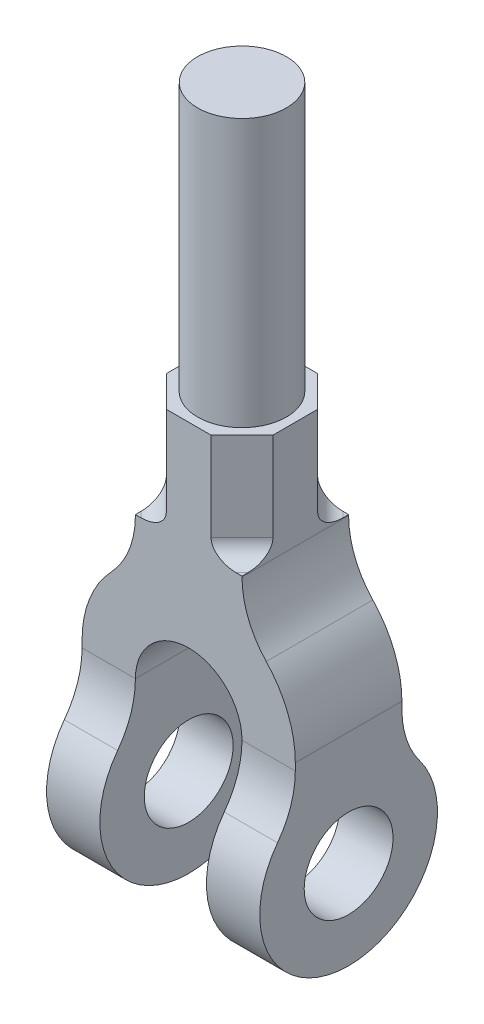
ISO-10303-21;
HEADER;
FILE_DESCRIPTION(('STEP AP214'),'2;1');
FILE_NAME('part.step','',(''),(''),'','','');
FILE_SCHEMA(('AUTOMOTIVE_DESIGN { 1 0 10303 214 1 1 1 1 }'));
ENDSEC;
DATA;
#1=APPLICATION_CONTEXT('core data for automotive mechanical design processes');
#2=APPLICATION_PROTOCOL_DEFINITION('international standard','automotive_design',2000,#1);
#3=PRODUCT_CONTEXT('',#1,'mechanical');
#4=PRODUCT('Part','Part','',(#3));
#5=PRODUCT_RELATED_PRODUCT_CATEGORY('part','',(#4));
#6=PRODUCT_DEFINITION_FORMATION('','',#4);
#7=PRODUCT_DEFINITION_CONTEXT('part definition',#1,'design');
#8=PRODUCT_DEFINITION('design','',#6,#7);
#9=PRODUCT_DEFINITION_SHAPE('','',#8);
#10=(LENGTH_UNIT() NAMED_UNIT(*) SI_UNIT(.MILLI.,.METRE.));
#11=(NAMED_UNIT(*) PLANE_ANGLE_UNIT() SI_UNIT($,.RADIAN.));
#12=(NAMED_UNIT(*) SI_UNIT($,.STERADIAN.) SOLID_ANGLE_UNIT());
#13=UNCERTAINTY_MEASURE_WITH_UNIT(LENGTH_MEASURE(1.E-05),#10,'distance_accuracy_value','');
#14=(GEOMETRIC_REPRESENTATION_CONTEXT(3) GLOBAL_UNCERTAINTY_ASSIGNED_CONTEXT((#13)) GLOBAL_UNIT_ASSIGNED_CONTEXT((#10,
#11,#12)) REPRESENTATION_CONTEXT('',''));
#15=CARTESIAN_POINT('',(0.,0.,0.));
#16=DIRECTION('',(0.,0.,1.));
#17=DIRECTION('',(1.,0.,0.));
#18=AXIS2_PLACEMENT_3D('',#15,#16,#17);
#19=CARTESIAN_POINT('',(-60.,125.,100.));
#20=DIRECTION('',(0.,-1.,0.));
#21=DIRECTION('',(0.,0.,-1.));
#22=AXIS2_PLACEMENT_3D('',#19,#20,#21);
#23=PLANE('',#22);
#24=CARTESIAN_POINT('',(0.,125.,50.));
#25=DIRECTION('',(0.,1.,0.));
#26=DIRECTION('',(0.,0.,1.));
#27=AXIS2_PLACEMENT_3D('',#24,#25,#26);
#28=CIRCLE('',#27,25.);
#29=CARTESIAN_POINT('',(0.,125.,75.));
#30=VERTEX_POINT('',#29);
#31=EDGE_CURVE('E445',#30,#30,#28,.T.);
#32=ORIENTED_EDGE('',*,*,#31,.F.);
#33=EDGE_LOOP('',(#32));
#34=FACE_BOUND('',#33,.T.);
#35=DIRECTION('',(0.,0.,1.));
#36=VECTOR('',#35,1.);
#37=CARTESIAN_POINT('',(30.,125.,0.));
#38=LINE('',#37,#36);
#39=CARTESIAN_POINT('',(30.,125.,37.4));
#40=VERTEX_POINT('',#39);
#41=CARTESIAN_POINT('',(30.,125.,62.6000000000004));
#42=VERTEX_POINT('',#41);
#43=EDGE_CURVE('E411',#40,#42,#38,.T.);
#44=ORIENTED_EDGE('',*,*,#43,.F.);
#45=DIRECTION('',(0.707106781186548,0.,0.707106781186547));
#46=VECTOR('',#45,1.);
#47=CARTESIAN_POINT('',(-3.70000000000003,125.,3.70000000000003));
#48=LINE('',#47,#46);
#49=CARTESIAN_POINT('',(12.6,125.,20.));
#50=VERTEX_POINT('',#49);
#51=EDGE_CURVE('E533',#50,#40,#48,.T.);
#52=ORIENTED_EDGE('',*,*,#51,.F.);
#53=DIRECTION('',(1.,0.,0.));
#54=VECTOR('',#53,1.);
#55=CARTESIAN_POINT('',(-170.,125.,20.));
#56=LINE('',#55,#54);
#57=CARTESIAN_POINT('',(-12.5999999999991,125.,20.));
#58=VERTEX_POINT('',#57);
#59=EDGE_CURVE('E571',#58,#50,#56,.T.);
#60=ORIENTED_EDGE('',*,*,#59,.F.);
#61=DIRECTION('',(0.707106781186554,0.,-0.707106781186541));
#62=VECTOR('',#61,1.);
#63=CARTESIAN_POINT('',(3.70000000000061,125.,3.70000000000068));
#64=LINE('',#63,#62);
#65=CARTESIAN_POINT('',(-30.,125.,37.4000000000006));
#66=VERTEX_POINT('',#65);
#67=EDGE_CURVE('E510',#66,#58,#64,.T.);
#68=ORIENTED_EDGE('',*,*,#67,.F.);
#69=DIRECTION('',(0.,0.,1.));
#70=VECTOR('',#69,1.);
#71=CARTESIAN_POINT('',(-30.,125.,0.));
#72=LINE('',#71,#70);
#73=CARTESIAN_POINT('',(-30.,125.,62.5999999999995));
#74=VERTEX_POINT('',#73);
#75=EDGE_CURVE('E320',#66,#74,#72,.T.);
#76=ORIENTED_EDGE('',*,*,#75,.T.);
#77=DIRECTION('',(-0.707106781186543,0.,-0.707106781186552));
#78=VECTOR('',#77,1.);
#79=CARTESIAN_POINT('',(-46.2999999999999,125.,46.2999999999993));
#80=LINE('',#79,#78);
#81=CARTESIAN_POINT('',(-12.5999999999997,125.,80.));
#82=VERTEX_POINT('',#81);
#83=EDGE_CURVE('E303',#82,#74,#80,.T.);
#84=ORIENTED_EDGE('',*,*,#83,.F.);
#85=DIRECTION('',(1.,0.,0.));
#86=VECTOR('',#85,1.);
#87=CARTESIAN_POINT('',(-170.,125.,80.));
#88=LINE('',#87,#86);
#89=CARTESIAN_POINT('',(12.6000000000003,125.,80.));
#90=VERTEX_POINT('',#89);
#91=EDGE_CURVE('E317',#82,#90,#88,.T.);
#92=ORIENTED_EDGE('',*,*,#91,.T.);
#93=DIRECTION('',(-0.70710678118655,0.,0.707106781186546));
#94=VECTOR('',#93,1.);
#95=CARTESIAN_POINT('',(46.3000000000001,125.,46.3000000000004));
#96=LINE('',#95,#94);
#97=EDGE_CURVE('E517',#42,#90,#96,.T.);
#98=ORIENTED_EDGE('',*,*,#97,.F.);
#99=EDGE_LOOP('',(#44,#52,#60,#68,#76,#84,#92,#98));
#100=FACE_BOUND('',#99,.T.);
#101=ADVANCED_FACE('F115',(#34,#100),#23,.F.);
#102=CARTESIAN_POINT('',(-60.,-125.,100.));
#103=DIRECTION('',(1.,0.,0.));
#104=DIRECTION('',(0.,0.,-1.));
#105=AXIS2_PLACEMENT_3D('',#102,#103,#104);
#106=PLANE('',#105);
#107=CARTESIAN_POINT('',(-60.,-75.,50.));
#108=DIRECTION('',(1.,0.,0.));
#109=DIRECTION('',(0.,0.,-1.));
#110=AXIS2_PLACEMENT_3D('',#107,#108,#109);
#111=CIRCLE('',#110,25.);
#112=CARTESIAN_POINT('',(-60.,-75.,25.));
#113=VERTEX_POINT('',#112);
#114=EDGE_CURVE('E566',#113,#113,#111,.T.);
#115=ORIENTED_EDGE('',*,*,#114,.T.);
#116=EDGE_LOOP('',(#115));
#117=FACE_BOUND('',#116,.T.);
#118=DIRECTION('',(0.,1.,0.));
#119=VECTOR('',#118,1.);
#120=CARTESIAN_POINT('',(-60.,-125.,20.));
#121=LINE('',#120,#119);
#122=CARTESIAN_POINT('',(-60.,-15.,20.));
#123=VERTEX_POINT('',#122);
#124=CARTESIAN_POINT('',(-60.,-11.,20.));
#125=VERTEX_POINT('',#124);
#126=EDGE_CURVE('E608',#123,#125,#121,.T.);
#127=ORIENTED_EDGE('',*,*,#126,.F.);
#128=CARTESIAN_POINT('',(-60.,-15.,-30.));
#129=DIRECTION('',(1.,0.,0.));
#130=DIRECTION('',(0.,0.,-1.));
#131=AXIS2_PLACEMENT_3D('',#128,#129,#130);
#132=CIRCLE('',#131,50.);
#133=CARTESIAN_POINT('',(-60.,-45.,9.99999999999999));
#134=VERTEX_POINT('',#133);
#135=EDGE_CURVE('E340',#123,#134,#132,.T.);
#136=ORIENTED_EDGE('',*,*,#135,.T.);
#137=CARTESIAN_POINT('',(-60.,-75.,50.));
#138=DIRECTION('',(1.,0.,0.));
#139=DIRECTION('',(0.,0.,-1.));
#140=AXIS2_PLACEMENT_3D('',#137,#138,#139);
#141=CIRCLE('',#140,50.);
#142=CARTESIAN_POINT('',(-60.,-45.,90.));
#143=VERTEX_POINT('',#142);
#144=EDGE_CURVE('E394',#143,#134,#141,.T.);
#145=ORIENTED_EDGE('',*,*,#144,.F.);
#146=CARTESIAN_POINT('',(-60.,-15.,130.));
#147=DIRECTION('',(1.,0.,0.));
#148=DIRECTION('',(0.,0.,-1.));
#149=AXIS2_PLACEMENT_3D('',#146,#147,#148);
#150=CIRCLE('',#149,50.);
#151=CARTESIAN_POINT('',(-60.,-15.,80.));
#152=VERTEX_POINT('',#151);
#153=EDGE_CURVE('E383',#143,#152,#150,.T.);
#154=ORIENTED_EDGE('',*,*,#153,.T.);
#155=DIRECTION('',(0.,-1.,0.));
#156=VECTOR('',#155,1.);
#157=CARTESIAN_POINT('',(-60.,-125.,80.));
#158=LINE('',#157,#156);
#159=CARTESIAN_POINT('',(-60.,-11.,80.));
#160=VERTEX_POINT('',#159);
#161=EDGE_CURVE('E373',#160,#152,#158,.T.);
#162=ORIENTED_EDGE('',*,*,#161,.F.);
#163=DIRECTION('',(0.,0.,1.));
#164=VECTOR('',#163,1.);
#165=CARTESIAN_POINT('',(-60.,-11.,0.));
#166=LINE('',#165,#164);
#167=EDGE_CURVE('E421',#125,#160,#166,.T.);
#168=ORIENTED_EDGE('',*,*,#167,.F.);
#169=EDGE_LOOP('',(#127,#136,#145,#154,#162,#168));
#170=FACE_BOUND('',#169,.T.);
#171=ADVANCED_FACE('F624',(#117,#170),#106,.F.);
#172=CARTESIAN_POINT('',(60.,-125.,100.));
#173=DIRECTION('',(-1.,0.,0.));
#174=DIRECTION('',(0.,0.,1.));
#175=AXIS2_PLACEMENT_3D('',#172,#173,#174);
#176=PLANE('',#175);
#177=CARTESIAN_POINT('',(60.,-75.,50.));
#178=DIRECTION('',(-1.,0.,0.));
#179=DIRECTION('',(0.,0.,1.));
#180=AXIS2_PLACEMENT_3D('',#177,#178,#179);
#181=CIRCLE('',#180,25.);
#182=CARTESIAN_POINT('',(60.,-75.,75.));
#183=VERTEX_POINT('',#182);
#184=EDGE_CURVE('E562',#183,#183,#181,.T.);
#185=ORIENTED_EDGE('',*,*,#184,.T.);
#186=EDGE_LOOP('',(#185));
#187=FACE_BOUND('',#186,.T.);
#188=DIRECTION('',(0.,-1.,0.));
#189=VECTOR('',#188,1.);
#190=CARTESIAN_POINT('',(60.,-125.,20.));
#191=LINE('',#190,#189);
#192=CARTESIAN_POINT('',(60.,-11.,20.));
#193=VERTEX_POINT('',#192);
#194=CARTESIAN_POINT('',(60.,-15.,20.));
#195=VERTEX_POINT('',#194);
#196=EDGE_CURVE('E591',#193,#195,#191,.T.);
#197=ORIENTED_EDGE('',*,*,#196,.F.);
#198=DIRECTION('',(0.,0.,1.));
#199=VECTOR('',#198,1.);
#200=CARTESIAN_POINT('',(60.,-11.,0.));
#201=LINE('',#200,#199);
#202=CARTESIAN_POINT('',(60.,-11.,80.));
#203=VERTEX_POINT('',#202);
#204=EDGE_CURVE('E401',#193,#203,#201,.T.);
#205=ORIENTED_EDGE('',*,*,#204,.T.);
#206=DIRECTION('',(0.,1.,0.));
#207=VECTOR('',#206,1.);
#208=CARTESIAN_POINT('',(60.,-125.,80.));
#209=LINE('',#208,#207);
#210=CARTESIAN_POINT('',(60.,-15.,80.));
#211=VERTEX_POINT('',#210);
#212=EDGE_CURVE('E353',#211,#203,#209,.T.);
#213=ORIENTED_EDGE('',*,*,#212,.F.);
#214=CARTESIAN_POINT('',(60.,-15.,130.));
#215=DIRECTION('',(-1.,0.,0.));
#216=DIRECTION('',(0.,0.,1.));
#217=AXIS2_PLACEMENT_3D('',#214,#215,#216);
#218=CIRCLE('',#217,50.);
#219=CARTESIAN_POINT('',(60.,-45.,90.));
#220=VERTEX_POINT('',#219);
#221=EDGE_CURVE('E379',#211,#220,#218,.T.);
#222=ORIENTED_EDGE('',*,*,#221,.T.);
#223=CARTESIAN_POINT('',(60.,-75.,50.));
#224=DIRECTION('',(-1.,0.,0.));
#225=DIRECTION('',(0.,0.,1.));
#226=AXIS2_PLACEMENT_3D('',#223,#224,#225);
#227=CIRCLE('',#226,50.);
#228=CARTESIAN_POINT('',(60.,-45.,9.99999999999999));
#229=VERTEX_POINT('',#228);
#230=EDGE_CURVE('E391',#229,#220,#227,.T.);
#231=ORIENTED_EDGE('',*,*,#230,.F.);
#232=CARTESIAN_POINT('',(60.,-15.,-30.));
#233=DIRECTION('',(-1.,0.,0.));
#234=DIRECTION('',(0.,0.,1.));
#235=AXIS2_PLACEMENT_3D('',#232,#233,#234);
#236=CIRCLE('',#235,50.);
#237=EDGE_CURVE('E613',#229,#195,#236,.T.);
#238=ORIENTED_EDGE('',*,*,#237,.T.);
#239=EDGE_LOOP('',(#197,#205,#213,#222,#231,#238));
#240=FACE_BOUND('',#239,.T.);
#241=ADVANCED_FACE('F667',(#187,#240),#176,.F.);
#242=CARTESIAN_POINT('',(-80.,64.4983443527074,0.));
#243=DIRECTION('',(0.,0.,1.));
#244=DIRECTION('',(1.,0.,0.));
#245=AXIS2_PLACEMENT_3D('',#242,#243,#244);
#246=CYLINDRICAL_SURFACE('',#245,50.);
#247=DIRECTION('',(0.,0.,1.));
#248=VECTOR('',#247,1.);
#249=CARTESIAN_POINT('',(-30.,64.4983443527075,0.));
#250=LINE('',#249,#248);
#251=CARTESIAN_POINT('',(-30.,64.4983443527075,20.));
#252=VERTEX_POINT('',#251);
#253=CARTESIAN_POINT('',(-30.,64.4983443527075,80.));
#254=VERTEX_POINT('',#253);
#255=EDGE_CURVE('E407',#252,#254,#250,.T.);
#256=ORIENTED_EDGE('',*,*,#255,.F.);
#257=CARTESIAN_POINT('',(-80.,64.4983443527074,20.));
#258=DIRECTION('',(0.,0.,-1.));
#259=DIRECTION('',(0.,1.,0.));
#260=AXIS2_PLACEMENT_3D('',#257,#258,#259);
#261=CIRCLE('',#260,50.);
#262=CARTESIAN_POINT('',(-43.6363636363636,30.1809151014768,20.));
#263=VERTEX_POINT('',#262);
#264=EDGE_CURVE('E600',#252,#263,#261,.T.);
#265=ORIENTED_EDGE('',*,*,#264,.T.);
#266=DIRECTION('',(0.,0.,1.));
#267=VECTOR('',#266,1.);
#268=CARTESIAN_POINT('',(-43.6363636363636,30.1809151014768,0.));
#269=LINE('',#268,#267);
#270=CARTESIAN_POINT('',(-43.6363636363636,30.1809151014768,80.));
#271=VERTEX_POINT('',#270);
#272=EDGE_CURVE('E417',#263,#271,#269,.T.);
#273=ORIENTED_EDGE('',*,*,#272,.T.);
#274=CARTESIAN_POINT('',(-80.,64.4983443527074,80.));
#275=DIRECTION('',(0.,0.,1.));
#276=DIRECTION('',(0.,-1.,0.));
#277=AXIS2_PLACEMENT_3D('',#274,#275,#276);
#278=CIRCLE('',#277,50.);
#279=EDGE_CURVE('E365',#271,#254,#278,.T.);
#280=ORIENTED_EDGE('',*,*,#279,.T.);
#281=EDGE_LOOP('',(#256,#265,#273,#280));
#282=FACE_BOUND('',#281,.T.);
#283=ADVANCED_FACE('F674',(#282),#246,.F.);
#284=CARTESIAN_POINT('',(0.,-11.,0.));
#285=DIRECTION('',(0.,0.,1.));
#286=DIRECTION('',(1.,0.,0.));
#287=AXIS2_PLACEMENT_3D('',#284,#285,#286);
#288=CYLINDRICAL_SURFACE('',#287,60.);
#289=ORIENTED_EDGE('',*,*,#272,.F.);
#290=CARTESIAN_POINT('',(0.,-11.,20.));
#291=DIRECTION('',(0.,0.,-1.));
#292=DIRECTION('',(0.,1.,0.));
#293=AXIS2_PLACEMENT_3D('',#290,#291,#292);
#294=CIRCLE('',#293,60.);
#295=EDGE_CURVE('E604',#263,#125,#294,.F.);
#296=ORIENTED_EDGE('',*,*,#295,.T.);
#297=ORIENTED_EDGE('',*,*,#167,.T.);
#298=CARTESIAN_POINT('',(0.,-11.,80.));
#299=DIRECTION('',(0.,0.,1.));
#300=DIRECTION('',(0.,-1.,0.));
#301=AXIS2_PLACEMENT_3D('',#298,#299,#300);
#302=CIRCLE('',#301,60.);
#303=EDGE_CURVE('E369',#160,#271,#302,.F.);
#304=ORIENTED_EDGE('',*,*,#303,.T.);
#305=EDGE_LOOP('',(#289,#296,#297,#304));
#306=FACE_BOUND('',#305,.T.);
#307=ADVANCED_FACE('F760',(#306),#288,.T.);
#308=CARTESIAN_POINT('',(-30.,0.,0.));
#309=DIRECTION('',(-1.,0.,0.));
#310=DIRECTION('',(0.,-1.,0.));
#311=AXIS2_PLACEMENT_3D('',#308,#309,#310);
#312=PLANE('',#311);
#313=DIRECTION('',(0.,0.,1.));
#314=VECTOR('',#313,1.);
#315=CARTESIAN_POINT('',(-30.,65.,0.));
#316=LINE('',#315,#314);
#317=CARTESIAN_POINT('',(-30.,65.,76.7421356237305));
#318=VERTEX_POINT('',#317);
#319=CARTESIAN_POINT('',(-30.,65.,80.));
#320=VERTEX_POINT('',#319);
#321=EDGE_CURVE('E311',#318,#320,#316,.T.);
#322=ORIENTED_EDGE('',*,*,#321,.F.);
#323=CARTESIAN_POINT('',(-30.,75.,76.7421356237305));
#324=DIRECTION('',(-1.,0.,0.));
#325=DIRECTION('',(0.,0.,-1.));
#326=AXIS2_PLACEMENT_3D('',#323,#324,#325);
#327=ELLIPSE('',#326,14.142135623731,10.);
#328=CARTESIAN_POINT('',(-30.,75.,62.5999999999995));
#329=VERTEX_POINT('',#328);
#330=EDGE_CURVE('E478',#318,#329,#327,.F.);
#331=ORIENTED_EDGE('',*,*,#330,.T.);
#332=DIRECTION('',(0.,1.,0.));
#333=VECTOR('',#332,1.);
#334=CARTESIAN_POINT('',(-30.,65.,62.5999999999995));
#335=LINE('',#334,#333);
#336=EDGE_CURVE('E310',#329,#74,#335,.T.);
#337=ORIENTED_EDGE('',*,*,#336,.T.);
#338=ORIENTED_EDGE('',*,*,#75,.F.);
#339=DIRECTION('',(0.,1.,0.));
#340=VECTOR('',#339,1.);
#341=CARTESIAN_POINT('',(-30.,65.,37.4000000000006));
#342=LINE('',#341,#340);
#343=CARTESIAN_POINT('',(-30.,75.,37.4000000000006));
#344=VERTEX_POINT('',#343);
#345=EDGE_CURVE('E551',#344,#66,#342,.T.);
#346=ORIENTED_EDGE('',*,*,#345,.F.);
#347=CARTESIAN_POINT('',(-30.,75.,23.2578643762698));
#348=DIRECTION('',(-1.,0.,0.));
#349=DIRECTION('',(0.,0.,-1.));
#350=AXIS2_PLACEMENT_3D('',#347,#348,#349);
#351=ELLIPSE('',#350,14.1421356237308,10.);
#352=CARTESIAN_POINT('',(-30.,65.,23.2578643762698));
#353=VERTEX_POINT('',#352);
#354=EDGE_CURVE('E487',#344,#353,#351,.F.);
#355=ORIENTED_EDGE('',*,*,#354,.T.);
#356=DIRECTION('',(0.,0.,1.));
#357=VECTOR('',#356,1.);
#358=CARTESIAN_POINT('',(-30.,65.,0.));
#359=LINE('',#358,#357);
#360=CARTESIAN_POINT('',(-30.,65.,20.));
#361=VERTEX_POINT('',#360);
#362=EDGE_CURVE('E544',#361,#353,#359,.T.);
#363=ORIENTED_EDGE('',*,*,#362,.F.);
#364=DIRECTION('',(0.,-1.,0.));
#365=VECTOR('',#364,1.);
#366=CARTESIAN_POINT('',(-30.,0.,20.));
#367=LINE('',#366,#365);
#368=EDGE_CURVE('E597',#361,#252,#367,.T.);
#369=ORIENTED_EDGE('',*,*,#368,.T.);
#370=ORIENTED_EDGE('',*,*,#255,.T.);
#371=DIRECTION('',(0.,1.,0.));
#372=VECTOR('',#371,1.);
#373=CARTESIAN_POINT('',(-30.,0.,80.));
#374=LINE('',#373,#372);
#375=EDGE_CURVE('E361',#254,#320,#374,.T.);
#376=ORIENTED_EDGE('',*,*,#375,.T.);
#377=EDGE_LOOP('',(#322,#331,#337,#338,#346,#355,#363,#369,#370,#376));
#378=FACE_BOUND('',#377,.T.);
#379=ADVANCED_FACE('F753',(#378),#312,.T.);
#380=CARTESIAN_POINT('',(0.,-15.,0.));
#381=DIRECTION('',(0.,0.,1.));
#382=DIRECTION('',(1.,0.,0.));
#383=AXIS2_PLACEMENT_3D('',#380,#381,#382);
#384=CYLINDRICAL_SURFACE('',#383,30.);
#385=CARTESIAN_POINT('',(0.,-15.,20.));
#386=DIRECTION('',(0.,0.,-1.));
#387=DIRECTION('',(0.,1.,0.));
#388=AXIS2_PLACEMENT_3D('',#385,#386,#387);
#389=CIRCLE('',#388,30.);
#390=CARTESIAN_POINT('',(30.,-15.,20.));
#391=VERTEX_POINT('',#390);
#392=CARTESIAN_POINT('',(-30.,-15.,20.));
#393=VERTEX_POINT('',#392);
#394=EDGE_CURVE('E594',#391,#393,#389,.F.);
#395=ORIENTED_EDGE('',*,*,#394,.F.);
#396=DIRECTION('',(0.,0.,1.));
#397=VECTOR('',#396,1.);
#398=CARTESIAN_POINT('',(30.,-15.,0.));
#399=LINE('',#398,#397);
#400=CARTESIAN_POINT('',(30.,-15.,80.));
#401=VERTEX_POINT('',#400);
#402=EDGE_CURVE('E398',#391,#401,#399,.T.);
#403=ORIENTED_EDGE('',*,*,#402,.T.);
#404=CARTESIAN_POINT('',(0.,-15.,80.));
#405=DIRECTION('',(0.,0.,1.));
#406=DIRECTION('',(0.,-1.,0.));
#407=AXIS2_PLACEMENT_3D('',#404,#405,#406);
#408=CIRCLE('',#407,30.);
#409=CARTESIAN_POINT('',(-30.,-15.,80.));
#410=VERTEX_POINT('',#409);
#411=EDGE_CURVE('E357',#410,#401,#408,.F.);
#412=ORIENTED_EDGE('',*,*,#411,.F.);
#413=DIRECTION('',(0.,0.,1.));
#414=VECTOR('',#413,1.);
#415=CARTESIAN_POINT('',(-30.,-15.,0.));
#416=LINE('',#415,#414);
#417=EDGE_CURVE('E397',#393,#410,#416,.T.);
#418=ORIENTED_EDGE('',*,*,#417,.F.);
#419=EDGE_LOOP('',(#395,#403,#412,#418));
#420=FACE_BOUND('',#419,.T.);
#421=ADVANCED_FACE('F723',(#420),#384,.F.);
#422=CARTESIAN_POINT('',(30.,0.,0.));
#423=DIRECTION('',(-1.,0.,0.));
#424=DIRECTION('',(0.,-1.,0.));
#425=AXIS2_PLACEMENT_3D('',#422,#423,#424);
#426=PLANE('',#425);
#427=CARTESIAN_POINT('',(30.,-75.,50.));
#428=DIRECTION('',(-1.,0.,0.));
#429=DIRECTION('',(0.,-1.,0.));
#430=AXIS2_PLACEMENT_3D('',#427,#428,#429);
#431=CIRCLE('',#430,25.);
#432=CARTESIAN_POINT('',(30.,-100.,50.));
#433=VERTEX_POINT('',#432);
#434=EDGE_CURVE('E450',#433,#433,#431,.T.);
#435=ORIENTED_EDGE('',*,*,#434,.F.);
#436=EDGE_LOOP('',(#435));
#437=FACE_BOUND('',#436,.T.);
#438=CARTESIAN_POINT('',(30.,-15.,-30.));
#439=DIRECTION('',(-1.,0.,0.));
#440=DIRECTION('',(0.,-1.,0.));
#441=AXIS2_PLACEMENT_3D('',#438,#439,#440);
#442=CIRCLE('',#441,50.);
#443=CARTESIAN_POINT('',(30.,-45.,9.99999999999999));
#444=VERTEX_POINT('',#443);
#445=EDGE_CURVE('E611',#444,#391,#442,.T.);
#446=ORIENTED_EDGE('',*,*,#445,.F.);
#447=CARTESIAN_POINT('',(30.,-75.,50.));
#448=DIRECTION('',(-1.,0.,0.));
#449=DIRECTION('',(0.,-1.,0.));
#450=AXIS2_PLACEMENT_3D('',#447,#448,#449);
#451=CIRCLE('',#450,50.);
#452=CARTESIAN_POINT('',(30.,-45.,90.));
#453=VERTEX_POINT('',#452);
#454=EDGE_CURVE('E387',#444,#453,#451,.T.);
#455=ORIENTED_EDGE('',*,*,#454,.T.);
#456=CARTESIAN_POINT('',(30.,-15.,130.));
#457=DIRECTION('',(-1.,0.,0.));
#458=DIRECTION('',(0.,-1.,0.));
#459=AXIS2_PLACEMENT_3D('',#456,#457,#458);
#460=CIRCLE('',#459,50.);
#461=EDGE_CURVE('E376',#401,#453,#460,.T.);
#462=ORIENTED_EDGE('',*,*,#461,.F.);
#463=ORIENTED_EDGE('',*,*,#402,.F.);
#464=EDGE_LOOP('',(#446,#455,#462,#463));
#465=FACE_BOUND('',#464,.T.);
#466=ADVANCED_FACE('F719',(#437,#465),#426,.T.);
#467=CARTESIAN_POINT('',(-30.,0.,0.));
#468=DIRECTION('',(-1.,0.,0.));
#469=DIRECTION('',(0.,-1.,0.));
#470=AXIS2_PLACEMENT_3D('',#467,#468,#469);
#471=PLANE('',#470);
#472=CARTESIAN_POINT('',(-30.,-75.,50.));
#473=DIRECTION('',(-1.,0.,0.));
#474=DIRECTION('',(0.,-1.,0.));
#475=AXIS2_PLACEMENT_3D('',#472,#473,#474);
#476=CIRCLE('',#475,25.);
#477=CARTESIAN_POINT('',(-30.,-100.,50.));
#478=VERTEX_POINT('',#477);
#479=EDGE_CURVE('E446',#478,#478,#476,.T.);
#480=ORIENTED_EDGE('',*,*,#479,.T.);
#481=EDGE_LOOP('',(#480));
#482=FACE_BOUND('',#481,.T.);
#483=CARTESIAN_POINT('',(-30.,-75.,50.));
#484=DIRECTION('',(-1.,0.,0.));
#485=DIRECTION('',(0.,-1.,0.));
#486=AXIS2_PLACEMENT_3D('',#483,#484,#485);
#487=CIRCLE('',#486,50.);
#488=CARTESIAN_POINT('',(-30.,-45.,9.99999999999999));
#489=VERTEX_POINT('',#488);
#490=CARTESIAN_POINT('',(-30.,-45.,90.));
#491=VERTEX_POINT('',#490);
#492=EDGE_CURVE('E431',#489,#491,#487,.T.);
#493=ORIENTED_EDGE('',*,*,#492,.F.);
#494=CARTESIAN_POINT('',(-30.,-15.,-30.));
#495=DIRECTION('',(-1.,0.,0.));
#496=DIRECTION('',(0.,-1.,0.));
#497=AXIS2_PLACEMENT_3D('',#494,#495,#496);
#498=CIRCLE('',#497,50.);
#499=EDGE_CURVE('E441',#489,#393,#498,.T.);
#500=ORIENTED_EDGE('',*,*,#499,.T.);
#501=ORIENTED_EDGE('',*,*,#417,.T.);
#502=CARTESIAN_POINT('',(-30.,-15.,130.));
#503=DIRECTION('',(-1.,0.,0.));
#504=DIRECTION('',(0.,-1.,0.));
#505=AXIS2_PLACEMENT_3D('',#502,#503,#504);
#506=CIRCLE('',#505,50.);
#507=EDGE_CURVE('E434',#410,#491,#506,.T.);
#508=ORIENTED_EDGE('',*,*,#507,.T.);
#509=EDGE_LOOP('',(#493,#500,#501,#508));
#510=FACE_BOUND('',#509,.T.);
#511=ADVANCED_FACE('F746',(#482,#510),#471,.F.);
#512=CARTESIAN_POINT('',(0.,-11.,0.));
#513=DIRECTION('',(0.,0.,1.));
#514=DIRECTION('',(1.,0.,0.));
#515=AXIS2_PLACEMENT_3D('',#512,#513,#514);
#516=CYLINDRICAL_SURFACE('',#515,60.);
#517=ORIENTED_EDGE('',*,*,#204,.F.);
#518=CARTESIAN_POINT('',(0.,-11.,20.));
#519=DIRECTION('',(0.,0.,-1.));
#520=DIRECTION('',(0.,1.,0.));
#521=AXIS2_PLACEMENT_3D('',#518,#519,#520);
#522=CIRCLE('',#521,60.);
#523=CARTESIAN_POINT('',(43.6363636363636,30.1809151014768,20.));
#524=VERTEX_POINT('',#523);
#525=EDGE_CURVE('E587',#193,#524,#522,.F.);
#526=ORIENTED_EDGE('',*,*,#525,.T.);
#527=DIRECTION('',(0.,0.,1.));
#528=VECTOR('',#527,1.);
#529=CARTESIAN_POINT('',(43.6363636363636,30.1809151014768,0.));
#530=LINE('',#529,#528);
#531=CARTESIAN_POINT('',(43.6363636363636,30.1809151014768,80.));
#532=VERTEX_POINT('',#531);
#533=EDGE_CURVE('E404',#524,#532,#530,.T.);
#534=ORIENTED_EDGE('',*,*,#533,.T.);
#535=CARTESIAN_POINT('',(0.,-11.,80.));
#536=DIRECTION('',(0.,0.,1.));
#537=DIRECTION('',(0.,-1.,0.));
#538=AXIS2_PLACEMENT_3D('',#535,#536,#537);
#539=CIRCLE('',#538,60.);
#540=EDGE_CURVE('E334',#532,#203,#539,.F.);
#541=ORIENTED_EDGE('',*,*,#540,.T.);
#542=EDGE_LOOP('',(#517,#526,#534,#541));
#543=FACE_BOUND('',#542,.T.);
#544=ADVANCED_FACE('F710',(#543),#516,.T.);
#545=CARTESIAN_POINT('',(80.,64.4983443527075,0.));
#546=DIRECTION('',(0.,0.,1.));
#547=DIRECTION('',(1.,0.,0.));
#548=AXIS2_PLACEMENT_3D('',#545,#546,#547);
#549=CYLINDRICAL_SURFACE('',#548,50.);
#550=CARTESIAN_POINT('',(80.,64.4983443527075,20.));
#551=DIRECTION('',(0.,0.,-1.));
#552=DIRECTION('',(0.,1.,0.));
#553=AXIS2_PLACEMENT_3D('',#550,#551,#552);
#554=CIRCLE('',#553,50.);
#555=CARTESIAN_POINT('',(30.,64.4983443527075,20.));
#556=VERTEX_POINT('',#555);
#557=EDGE_CURVE('E575',#556,#524,#554,.F.);
#558=ORIENTED_EDGE('',*,*,#557,.F.);
#559=DIRECTION('',(0.,0.,1.));
#560=VECTOR('',#559,1.);
#561=CARTESIAN_POINT('',(30.,64.4983443527075,0.));
#562=LINE('',#561,#560);
#563=CARTESIAN_POINT('',(30.,64.4983443527075,80.));
#564=VERTEX_POINT('',#563);
#565=EDGE_CURVE('E408',#556,#564,#562,.T.);
#566=ORIENTED_EDGE('',*,*,#565,.T.);
#567=CARTESIAN_POINT('',(80.,64.4983443527075,80.));
#568=DIRECTION('',(0.,0.,1.));
#569=DIRECTION('',(0.,-1.,0.));
#570=AXIS2_PLACEMENT_3D('',#567,#568,#569);
#571=CIRCLE('',#570,50.);
#572=EDGE_CURVE('E328',#532,#564,#571,.F.);
#573=ORIENTED_EDGE('',*,*,#572,.F.);
#574=ORIENTED_EDGE('',*,*,#533,.F.);
#575=EDGE_LOOP('',(#558,#566,#573,#574));
#576=FACE_BOUND('',#575,.T.);
#577=ADVANCED_FACE('F705',(#576),#549,.F.);
#578=CARTESIAN_POINT('',(30.,0.,0.));
#579=DIRECTION('',(-1.,0.,0.));
#580=DIRECTION('',(0.,0.,1.));
#581=AXIS2_PLACEMENT_3D('',#578,#579,#580);
#582=PLANE('',#581);
#583=DIRECTION('',(0.,0.,-1.));
#584=VECTOR('',#583,1.);
#585=CARTESIAN_POINT('',(30.,65.,0.));
#586=LINE('',#585,#584);
#587=CARTESIAN_POINT('',(30.,65.,23.2578643762691));
#588=VERTEX_POINT('',#587);
#589=CARTESIAN_POINT('',(30.,65.,20.));
#590=VERTEX_POINT('',#589);
#591=EDGE_CURVE('E532',#588,#590,#586,.T.);
#592=ORIENTED_EDGE('',*,*,#591,.F.);
#593=CARTESIAN_POINT('',(30.,75.,23.2578643762691));
#594=DIRECTION('',(-1.,0.,0.));
#595=DIRECTION('',(0.,0.,1.));
#596=AXIS2_PLACEMENT_3D('',#593,#594,#595);
#597=ELLIPSE('',#596,14.1421356237309,10.);
#598=CARTESIAN_POINT('',(30.,75.,37.4));
#599=VERTEX_POINT('',#598);
#600=EDGE_CURVE('E490',#588,#599,#597,.T.);
#601=ORIENTED_EDGE('',*,*,#600,.T.);
#602=DIRECTION('',(0.,1.,0.));
#603=VECTOR('',#602,1.);
#604=CARTESIAN_POINT('',(30.,65.,37.4));
#605=LINE('',#604,#603);
#606=EDGE_CURVE('E523',#599,#40,#605,.T.);
#607=ORIENTED_EDGE('',*,*,#606,.T.);
#608=ORIENTED_EDGE('',*,*,#43,.T.);
#609=DIRECTION('',(0.,1.,0.));
#610=VECTOR('',#609,1.);
#611=CARTESIAN_POINT('',(30.,65.,62.6000000000004));
#612=LINE('',#611,#610);
#613=CARTESIAN_POINT('',(30.,75.,62.6000000000004));
#614=VERTEX_POINT('',#613);
#615=EDGE_CURVE('E520',#614,#42,#612,.T.);
#616=ORIENTED_EDGE('',*,*,#615,.F.);
#617=CARTESIAN_POINT('',(30.,75.,76.7421356237313));
#618=DIRECTION('',(-1.,0.,0.));
#619=DIRECTION('',(0.,0.,1.));
#620=AXIS2_PLACEMENT_3D('',#617,#618,#619);
#621=ELLIPSE('',#620,14.1421356237309,10.);
#622=CARTESIAN_POINT('',(30.,65.,76.7421356237313));
#623=VERTEX_POINT('',#622);
#624=EDGE_CURVE('E12',#614,#623,#621,.T.);
#625=ORIENTED_EDGE('',*,*,#624,.T.);
#626=DIRECTION('',(0.,0.,-1.));
#627=VECTOR('',#626,1.);
#628=CARTESIAN_POINT('',(30.,65.,0.));
#629=LINE('',#628,#627);
#630=CARTESIAN_POINT('',(30.,65.,80.));
#631=VERTEX_POINT('',#630);
#632=EDGE_CURVE('E512',#631,#623,#629,.T.);
#633=ORIENTED_EDGE('',*,*,#632,.F.);
#634=DIRECTION('',(0.,1.,0.));
#635=VECTOR('',#634,1.);
#636=CARTESIAN_POINT('',(30.,0.,80.));
#637=LINE('',#636,#635);
#638=EDGE_CURVE('E420',#564,#631,#637,.T.);
#639=ORIENTED_EDGE('',*,*,#638,.F.);
#640=ORIENTED_EDGE('',*,*,#565,.F.);
#641=DIRECTION('',(0.,-1.,0.));
#642=VECTOR('',#641,1.);
#643=CARTESIAN_POINT('',(30.,0.,20.));
#644=LINE('',#643,#642);
#645=EDGE_CURVE('E438',#590,#556,#644,.T.);
#646=ORIENTED_EDGE('',*,*,#645,.F.);
#647=EDGE_LOOP('',(#592,#601,#607,#608,#616,#625,#633,#639,#640,#646));
#648=FACE_BOUND('',#647,.T.);
#649=ADVANCED_FACE('F698',(#648),#582,.F.);
#650=CARTESIAN_POINT('',(-170.,-75.,50.));
#651=DIRECTION('',(1.,0.,0.));
#652=DIRECTION('',(0.,0.,-1.));
#653=AXIS2_PLACEMENT_3D('',#650,#651,#652);
#654=CYLINDRICAL_SURFACE('',#653,50.);
#655=ORIENTED_EDGE('',*,*,#144,.T.);
#656=DIRECTION('',(1.,0.,0.));
#657=VECTOR('',#656,1.);
#658=CARTESIAN_POINT('',(-170.,-45.,9.99999999999999));
#659=LINE('',#658,#657);
#660=EDGE_CURVE('E576',#134,#489,#659,.T.);
#661=ORIENTED_EDGE('',*,*,#660,.T.);
#662=ORIENTED_EDGE('',*,*,#492,.T.);
#663=DIRECTION('',(1.,0.,0.));
#664=VECTOR('',#663,1.);
#665=CARTESIAN_POINT('',(-170.,-45.,90.));
#666=LINE('',#665,#664);
#667=EDGE_CURVE('E345',#143,#491,#666,.T.);
#668=ORIENTED_EDGE('',*,*,#667,.F.);
#669=EDGE_LOOP('',(#655,#661,#662,#668));
#670=FACE_BOUND('',#669,.T.);
#671=ADVANCED_FACE('F733',(#670),#654,.T.);
#672=ORIENTED_EDGE('',*,*,#230,.T.);
#673=EDGE_CURVE('E346',#453,#220,#666,.T.);
#674=ORIENTED_EDGE('',*,*,#673,.F.);
#675=ORIENTED_EDGE('',*,*,#454,.F.);
#676=EDGE_CURVE('E577',#444,#229,#659,.T.);
#677=ORIENTED_EDGE('',*,*,#676,.T.);
#678=EDGE_LOOP('',(#672,#674,#675,#677));
#679=FACE_BOUND('',#678,.T.);
#680=ADVANCED_FACE('F730',(#679),#654,.T.);
#681=CARTESIAN_POINT('',(-170.,-15.,130.));
#682=DIRECTION('',(1.,0.,0.));
#683=DIRECTION('',(0.,0.,-1.));
#684=AXIS2_PLACEMENT_3D('',#681,#682,#683);
#685=CYLINDRICAL_SURFACE('',#684,50.);
#686=ORIENTED_EDGE('',*,*,#667,.T.);
#687=ORIENTED_EDGE('',*,*,#507,.F.);
#688=DIRECTION('',(1.,0.,0.));
#689=VECTOR('',#688,1.);
#690=CARTESIAN_POINT('',(-170.,-15.,80.));
#691=LINE('',#690,#689);
#692=EDGE_CURVE('E329',#152,#410,#691,.T.);
#693=ORIENTED_EDGE('',*,*,#692,.F.);
#694=ORIENTED_EDGE('',*,*,#153,.F.);
#695=EDGE_LOOP('',(#686,#687,#693,#694));
#696=FACE_BOUND('',#695,.T.);
#697=ADVANCED_FACE('F732',(#696),#685,.F.);
#698=EDGE_CURVE('E337',#401,#211,#691,.T.);
#699=ORIENTED_EDGE('',*,*,#698,.F.);
#700=ORIENTED_EDGE('',*,*,#461,.T.);
#701=ORIENTED_EDGE('',*,*,#673,.T.);
#702=ORIENTED_EDGE('',*,*,#221,.F.);
#703=EDGE_LOOP('',(#699,#700,#701,#702));
#704=FACE_BOUND('',#703,.T.);
#705=ADVANCED_FACE('F727',(#704),#685,.F.);
#706=CARTESIAN_POINT('',(-170.,0.,80.));
#707=DIRECTION('',(0.,0.,1.));
#708=DIRECTION('',(0.,-1.,0.));
#709=AXIS2_PLACEMENT_3D('',#706,#707,#708);
#710=PLANE('',#709);
#711=DIRECTION('',(1.,0.,0.));
#712=VECTOR('',#711,1.);
#713=CARTESIAN_POINT('',(0.,65.,80.));
#714=LINE('',#713,#712);
#715=CARTESIAN_POINT('',(26.7421356237313,65.,80.));
#716=VERTEX_POINT('',#715);
#717=EDGE_CURVE('E516',#716,#631,#714,.T.);
#718=ORIENTED_EDGE('',*,*,#717,.F.);
#719=CARTESIAN_POINT('',(26.7421356237313,75.,80.));
#720=DIRECTION('',(0.,0.,1.));
#721=DIRECTION('',(-1.,0.,0.));
#722=AXIS2_PLACEMENT_3D('',#719,#720,#721);
#723=ELLIPSE('',#722,14.142135623731,10.);
#724=CARTESIAN_POINT('',(12.6000000000003,75.,80.));
#725=VERTEX_POINT('',#724);
#726=EDGE_CURVE('E124',#716,#725,#723,.F.);
#727=ORIENTED_EDGE('',*,*,#726,.T.);
#728=DIRECTION('',(0.,1.,0.));
#729=VECTOR('',#728,1.);
#730=CARTESIAN_POINT('',(12.6000000000003,65.,80.));
#731=LINE('',#730,#729);
#732=EDGE_CURVE('E323',#725,#90,#731,.T.);
#733=ORIENTED_EDGE('',*,*,#732,.T.);
#734=ORIENTED_EDGE('',*,*,#91,.F.);
#735=DIRECTION('',(0.,1.,0.));
#736=VECTOR('',#735,1.);
#737=CARTESIAN_POINT('',(-12.5999999999997,65.,80.));
#738=LINE('',#737,#736);
#739=CARTESIAN_POINT('',(-12.5999999999997,75.,80.));
#740=VERTEX_POINT('',#739);
#741=EDGE_CURVE('E299',#740,#82,#738,.T.);
#742=ORIENTED_EDGE('',*,*,#741,.F.);
#743=CARTESIAN_POINT('',(-26.7421356237305,75.,80.));
#744=DIRECTION('',(0.,0.,1.));
#745=DIRECTION('',(-1.,0.,0.));
#746=AXIS2_PLACEMENT_3D('',#743,#744,#745);
#747=ELLIPSE('',#746,14.1421356237309,10.);
#748=CARTESIAN_POINT('',(-26.7421356237305,65.,80.));
#749=VERTEX_POINT('',#748);
#750=EDGE_CURVE('E481',#740,#749,#747,.F.);
#751=ORIENTED_EDGE('',*,*,#750,.T.);
#752=DIRECTION('',(1.,0.,0.));
#753=VECTOR('',#752,1.);
#754=CARTESIAN_POINT('',(0.,65.,80.));
#755=LINE('',#754,#753);
#756=EDGE_CURVE('E322',#320,#749,#755,.T.);
#757=ORIENTED_EDGE('',*,*,#756,.F.);
#758=ORIENTED_EDGE('',*,*,#375,.F.);
#759=ORIENTED_EDGE('',*,*,#279,.F.);
#760=ORIENTED_EDGE('',*,*,#303,.F.);
#761=ORIENTED_EDGE('',*,*,#161,.T.);
#762=ORIENTED_EDGE('',*,*,#692,.T.);
#763=ORIENTED_EDGE('',*,*,#411,.T.);
#764=ORIENTED_EDGE('',*,*,#698,.T.);
#765=ORIENTED_EDGE('',*,*,#212,.T.);
#766=ORIENTED_EDGE('',*,*,#540,.F.);
#767=ORIENTED_EDGE('',*,*,#572,.T.);
#768=ORIENTED_EDGE('',*,*,#638,.T.);
#769=EDGE_LOOP('',(#718,#727,#733,#734,#742,#751,#757,#758,#759,#760,#761,#762,#763,#764,#765,
#766,#767,#768));
#770=FACE_BOUND('',#769,.T.);
#771=ADVANCED_FACE('F325',(#770),#710,.T.);
#772=CARTESIAN_POINT('',(-170.,-15.,-30.));
#773=DIRECTION('',(1.,0.,0.));
#774=DIRECTION('',(0.,0.,-1.));
#775=AXIS2_PLACEMENT_3D('',#772,#773,#774);
#776=CYLINDRICAL_SURFACE('',#775,50.);
#777=DIRECTION('',(1.,0.,0.));
#778=VECTOR('',#777,1.);
#779=CARTESIAN_POINT('',(-170.,-15.,20.));
#780=LINE('',#779,#778);
#781=EDGE_CURVE('E581',#123,#393,#780,.T.);
#782=ORIENTED_EDGE('',*,*,#781,.T.);
#783=ORIENTED_EDGE('',*,*,#499,.F.);
#784=ORIENTED_EDGE('',*,*,#660,.F.);
#785=ORIENTED_EDGE('',*,*,#135,.F.);
#786=EDGE_LOOP('',(#782,#783,#784,#785));
#787=FACE_BOUND('',#786,.T.);
#788=ADVANCED_FACE('F630',(#787),#776,.F.);
#789=ORIENTED_EDGE('',*,*,#676,.F.);
#790=ORIENTED_EDGE('',*,*,#445,.T.);
#791=EDGE_CURVE('E570',#391,#195,#780,.T.);
#792=ORIENTED_EDGE('',*,*,#791,.T.);
#793=ORIENTED_EDGE('',*,*,#237,.F.);
#794=EDGE_LOOP('',(#789,#790,#792,#793));
#795=FACE_BOUND('',#794,.T.);
#796=ADVANCED_FACE('F715',(#795),#776,.F.);
#797=CARTESIAN_POINT('',(-170.,0.,20.));
#798=DIRECTION('',(0.,0.,-1.));
#799=DIRECTION('',(0.,1.,0.));
#800=AXIS2_PLACEMENT_3D('',#797,#798,#799);
#801=PLANE('',#800);
#802=DIRECTION('',(0.,1.,0.));
#803=VECTOR('',#802,1.);
#804=CARTESIAN_POINT('',(12.6,65.,20.));
#805=LINE('',#804,#803);
#806=CARTESIAN_POINT('',(12.6,75.,20.));
#807=VERTEX_POINT('',#806);
#808=EDGE_CURVE('E536',#807,#50,#805,.T.);
#809=ORIENTED_EDGE('',*,*,#808,.F.);
#810=CARTESIAN_POINT('',(26.7421356237309,75.,20.));
#811=DIRECTION('',(0.,0.,-1.));
#812=DIRECTION('',(1.,0.,0.));
#813=AXIS2_PLACEMENT_3D('',#810,#811,#812);
#814=ELLIPSE('',#813,14.142135623731,10.);
#815=CARTESIAN_POINT('',(26.7421356237309,65.,20.));
#816=VERTEX_POINT('',#815);
#817=EDGE_CURVE('E493',#807,#816,#814,.F.);
#818=ORIENTED_EDGE('',*,*,#817,.T.);
#819=DIRECTION('',(-1.,0.,0.));
#820=VECTOR('',#819,1.);
#821=CARTESIAN_POINT('',(0.,65.,20.));
#822=LINE('',#821,#820);
#823=EDGE_CURVE('E528',#590,#816,#822,.T.);
#824=ORIENTED_EDGE('',*,*,#823,.F.);
#825=ORIENTED_EDGE('',*,*,#645,.T.);
#826=ORIENTED_EDGE('',*,*,#557,.T.);
#827=ORIENTED_EDGE('',*,*,#525,.F.);
#828=ORIENTED_EDGE('',*,*,#196,.T.);
#829=ORIENTED_EDGE('',*,*,#791,.F.);
#830=ORIENTED_EDGE('',*,*,#394,.T.);
#831=ORIENTED_EDGE('',*,*,#781,.F.);
#832=ORIENTED_EDGE('',*,*,#126,.T.);
#833=ORIENTED_EDGE('',*,*,#295,.F.);
#834=ORIENTED_EDGE('',*,*,#264,.F.);
#835=ORIENTED_EDGE('',*,*,#368,.F.);
#836=DIRECTION('',(-1.,0.,0.));
#837=VECTOR('',#836,1.);
#838=CARTESIAN_POINT('',(0.,65.,20.));
#839=LINE('',#838,#837);
#840=CARTESIAN_POINT('',(-26.7421356237301,65.,20.));
#841=VERTEX_POINT('',#840);
#842=EDGE_CURVE('E548',#841,#361,#839,.T.);
#843=ORIENTED_EDGE('',*,*,#842,.F.);
#844=CARTESIAN_POINT('',(-26.7421356237301,75.,20.));
#845=DIRECTION('',(0.,0.,-1.));
#846=DIRECTION('',(1.,0.,0.));
#847=AXIS2_PLACEMENT_3D('',#844,#845,#846);
#848=ELLIPSE('',#847,14.1421356237311,10.);
#849=CARTESIAN_POINT('',(-12.5999999999991,75.,20.));
#850=VERTEX_POINT('',#849);
#851=EDGE_CURVE('E484',#841,#850,#848,.F.);
#852=ORIENTED_EDGE('',*,*,#851,.T.);
#853=DIRECTION('',(0.,1.,0.));
#854=VECTOR('',#853,1.);
#855=CARTESIAN_POINT('',(-12.5999999999991,65.,20.));
#856=LINE('',#855,#854);
#857=EDGE_CURVE('E451',#850,#58,#856,.T.);
#858=ORIENTED_EDGE('',*,*,#857,.T.);
#859=ORIENTED_EDGE('',*,*,#59,.T.);
#860=EDGE_LOOP('',(#809,#818,#824,#825,#826,#827,#828,#829,#830,#831,#832,#833,#834,#835,#843,
#852,#858,#859));
#861=FACE_BOUND('',#860,.T.);
#862=ADVANCED_FACE('F635',(#861),#801,.T.);
#863=CARTESIAN_POINT('',(-170.,-75.,50.));
#864=DIRECTION('',(1.,0.,0.));
#865=DIRECTION('',(0.,0.,-1.));
#866=AXIS2_PLACEMENT_3D('',#863,#864,#865);
#867=CYLINDRICAL_SURFACE('',#866,25.);
#868=ORIENTED_EDGE('',*,*,#479,.F.);
#869=EDGE_LOOP('',(#868));
#870=FACE_BOUND('',#869,.T.);
#871=ORIENTED_EDGE('',*,*,#114,.F.);
#872=EDGE_LOOP('',(#871));
#873=FACE_BOUND('',#872,.T.);
#874=ADVANCED_FACE('F822',(#870,#873),#867,.F.);
#875=ORIENTED_EDGE('',*,*,#434,.T.);
#876=EDGE_LOOP('',(#875));
#877=FACE_BOUND('',#876,.T.);
#878=ORIENTED_EDGE('',*,*,#184,.F.);
#879=EDGE_LOOP('',(#878));
#880=FACE_BOUND('',#879,.T.);
#881=ADVANCED_FACE('F821',(#877,#880),#867,.F.);
#882=CARTESIAN_POINT('',(3.70000000000061,65.,3.70000000000068));
#883=DIRECTION('',(0.707106781186541,0.,0.707106781186554));
#884=DIRECTION('',(0.707106781186554,0.,-0.707106781186541));
#885=AXIS2_PLACEMENT_3D('',#882,#883,#884);
#886=PLANE('',#885);
#887=ORIENTED_EDGE('',*,*,#857,.F.);
#888=DIRECTION('',(0.707106781186554,0.,-0.707106781186541));
#889=VECTOR('',#888,1.);
#890=CARTESIAN_POINT('',(3.70000000000061,75.,3.70000000000068));
#891=LINE('',#890,#889);
#892=EDGE_CURVE('E462',#850,#344,#891,.F.);
#893=ORIENTED_EDGE('',*,*,#892,.T.);
#894=ORIENTED_EDGE('',*,*,#345,.T.);
#895=ORIENTED_EDGE('',*,*,#67,.T.);
#896=EDGE_LOOP('',(#887,#893,#894,#895));
#897=FACE_BOUND('',#896,.T.);
#898=ADVANCED_FACE('F798',(#897),#886,.F.);
#899=CARTESIAN_POINT('',(0.,65.,0.));
#900=DIRECTION('',(0.,1.,0.));
#901=DIRECTION('',(0.,0.,1.));
#902=AXIS2_PLACEMENT_3D('',#899,#900,#901);
#903=PLANE('',#902);
#904=ORIENTED_EDGE('',*,*,#362,.T.);
#905=DIRECTION('',(0.707106781186554,0.,-0.707106781186541));
#906=VECTOR('',#905,1.);
#907=CARTESIAN_POINT('',(-3.3710678118648,65.,-3.37106781186486));
#908=LINE('',#907,#906);
#909=EDGE_CURVE('E458',#353,#841,#908,.T.);
#910=ORIENTED_EDGE('',*,*,#909,.T.);
#911=ORIENTED_EDGE('',*,*,#842,.T.);
#912=EDGE_LOOP('',(#904,#910,#911));
#913=FACE_BOUND('',#912,.T.);
#914=ADVANCED_FACE('F790',(#913),#903,.T.);
#915=CARTESIAN_POINT('',(-3.70000000000003,65.,3.70000000000003));
#916=DIRECTION('',(-0.707106781186547,0.,0.707106781186548));
#917=DIRECTION('',(0.707106781186548,0.,0.707106781186547));
#918=AXIS2_PLACEMENT_3D('',#915,#916,#917);
#919=PLANE('',#918);
#920=ORIENTED_EDGE('',*,*,#606,.F.);
#921=DIRECTION('',(0.707106781186548,0.,0.707106781186547));
#922=VECTOR('',#921,1.);
#923=CARTESIAN_POINT('',(-3.70000000000003,75.,3.70000000000003));
#924=LINE('',#923,#922);
#925=EDGE_CURVE('E469',#599,#807,#924,.F.);
#926=ORIENTED_EDGE('',*,*,#925,.T.);
#927=ORIENTED_EDGE('',*,*,#808,.T.);
#928=ORIENTED_EDGE('',*,*,#51,.T.);
#929=EDGE_LOOP('',(#920,#926,#927,#928));
#930=FACE_BOUND('',#929,.T.);
#931=ADVANCED_FACE('F802',(#930),#919,.F.);
#932=CARTESIAN_POINT('',(0.,65.,0.));
#933=DIRECTION('',(0.,1.,0.));
#934=DIRECTION('',(0.,0.,1.));
#935=AXIS2_PLACEMENT_3D('',#932,#933,#934);
#936=PLANE('',#935);
#937=ORIENTED_EDGE('',*,*,#823,.T.);
#938=DIRECTION('',(0.707106781186548,0.,0.707106781186547));
#939=VECTOR('',#938,1.);
#940=CARTESIAN_POINT('',(3.37106781186545,65.,-3.37106781186545));
#941=LINE('',#940,#939);
#942=EDGE_CURVE('E465',#816,#588,#941,.T.);
#943=ORIENTED_EDGE('',*,*,#942,.T.);
#944=ORIENTED_EDGE('',*,*,#591,.T.);
#945=EDGE_LOOP('',(#937,#943,#944));
#946=FACE_BOUND('',#945,.T.);
#947=ADVANCED_FACE('F695',(#946),#936,.T.);
#948=CARTESIAN_POINT('',(-46.2999999999999,65.,46.2999999999993));
#949=DIRECTION('',(0.707106781186552,0.,-0.707106781186543));
#950=DIRECTION('',(-0.707106781186543,0.,-0.707106781186552));
#951=AXIS2_PLACEMENT_3D('',#948,#949,#950);
#952=PLANE('',#951);
#953=ORIENTED_EDGE('',*,*,#336,.F.);
#954=DIRECTION('',(-0.707106781186543,0.,-0.707106781186552));
#955=VECTOR('',#954,1.);
#956=CARTESIAN_POINT('',(-46.2999999999999,75.,46.2999999999993));
#957=LINE('',#956,#955);
#958=EDGE_CURVE('E306',#329,#740,#957,.F.);
#959=ORIENTED_EDGE('',*,*,#958,.T.);
#960=ORIENTED_EDGE('',*,*,#741,.T.);
#961=ORIENTED_EDGE('',*,*,#83,.T.);
#962=EDGE_LOOP('',(#953,#959,#960,#961));
#963=FACE_BOUND('',#962,.T.);
#964=ADVANCED_FACE('F302',(#963),#952,.F.);
#965=CARTESIAN_POINT('',(0.,65.,0.));
#966=DIRECTION('',(0.,1.,0.));
#967=DIRECTION('',(0.,0.,1.));
#968=AXIS2_PLACEMENT_3D('',#965,#966,#967);
#969=PLANE('',#968);
#970=ORIENTED_EDGE('',*,*,#756,.T.);
#971=DIRECTION('',(-0.707106781186543,0.,-0.707106781186552));
#972=VECTOR('',#971,1.);
#973=CARTESIAN_POINT('',(-53.3710678118654,65.,53.3710678118648));
#974=LINE('',#973,#972);
#975=EDGE_CURVE('E452',#749,#318,#974,.T.);
#976=ORIENTED_EDGE('',*,*,#975,.T.);
#977=ORIENTED_EDGE('',*,*,#321,.T.);
#978=EDGE_LOOP('',(#970,#976,#977));
#979=FACE_BOUND('',#978,.T.);
#980=ADVANCED_FACE('F782',(#979),#969,.T.);
#981=CARTESIAN_POINT('',(46.3000000000001,65.,46.3000000000004));
#982=DIRECTION('',(-0.707106781186545,0.,-0.707106781186549));
#983=DIRECTION('',(-0.70710678118655,0.,0.707106781186546));
#984=AXIS2_PLACEMENT_3D('',#981,#982,#983);
#985=PLANE('',#984);
#986=ORIENTED_EDGE('',*,*,#732,.F.);
#987=DIRECTION('',(-0.70710678118655,0.,0.707106781186546));
#988=VECTOR('',#987,1.);
#989=CARTESIAN_POINT('',(46.3000000000001,75.,46.3000000000004));
#990=LINE('',#989,#988);
#991=EDGE_CURVE('E131',#725,#614,#990,.F.);
#992=ORIENTED_EDGE('',*,*,#991,.T.);
#993=ORIENTED_EDGE('',*,*,#615,.T.);
#994=ORIENTED_EDGE('',*,*,#97,.T.);
#995=EDGE_LOOP('',(#986,#992,#993,#994));
#996=FACE_BOUND('',#995,.T.);
#997=ADVANCED_FACE('F657',(#996),#985,.F.);
#998=CARTESIAN_POINT('',(0.,65.,0.));
#999=DIRECTION('',(0.,1.,0.));
#1000=DIRECTION('',(0.,0.,1.));
#1001=AXIS2_PLACEMENT_3D('',#998,#999,#1000);
#1002=PLANE('',#1001);
#1003=ORIENTED_EDGE('',*,*,#632,.T.);
#1004=DIRECTION('',(-0.70710678118655,0.,0.707106781186546));
#1005=VECTOR('',#1004,1.);
#1006=CARTESIAN_POINT('',(53.3710678118656,65.,53.3710678118659));
#1007=LINE('',#1006,#1005);
#1008=EDGE_CURVE('E472',#623,#716,#1007,.T.);
#1009=ORIENTED_EDGE('',*,*,#1008,.T.);
#1010=ORIENTED_EDGE('',*,*,#717,.T.);
#1011=EDGE_LOOP('',(#1003,#1009,#1010));
#1012=FACE_BOUND('',#1011,.T.);
#1013=ADVANCED_FACE('F648',(#1012),#1002,.T.);
#1014=CARTESIAN_POINT('',(0.,275.7,50.));
#1015=DIRECTION('',(0.,-1.,0.));
#1016=DIRECTION('',(0.,0.,-1.));
#1017=AXIS2_PLACEMENT_3D('',#1014,#1015,#1016);
#1018=CYLINDRICAL_SURFACE('',#1017,25.);
#1019=CARTESIAN_POINT('',(0.,275.7,50.));
#1020=DIRECTION('',(0.,1.,0.));
#1021=DIRECTION('',(0.,0.,1.));
#1022=AXIS2_PLACEMENT_3D('',#1019,#1020,#1021);
#1023=CIRCLE('',#1022,25.);
#1024=CARTESIAN_POINT('',(0.,275.7,75.));
#1025=VERTEX_POINT('',#1024);
#1026=EDGE_CURVE('E503',#1025,#1025,#1023,.T.);
#1027=ORIENTED_EDGE('',*,*,#1026,.F.);
#1028=EDGE_LOOP('',(#1027));
#1029=FACE_BOUND('',#1028,.T.);
#1030=ORIENTED_EDGE('',*,*,#31,.T.);
#1031=EDGE_LOOP('',(#1030));
#1032=FACE_BOUND('',#1031,.T.);
#1033=ADVANCED_FACE('F646',(#1029,#1032),#1018,.T.);
#1034=CARTESIAN_POINT('',(0.,275.7,0.));
#1035=DIRECTION('',(0.,1.,0.));
#1036=DIRECTION('',(0.,0.,1.));
#1037=AXIS2_PLACEMENT_3D('',#1034,#1035,#1036);
#1038=PLANE('',#1037);
#1039=ORIENTED_EDGE('',*,*,#1026,.T.);
#1040=EDGE_LOOP('',(#1039));
#1041=FACE_BOUND('',#1040,.T.);
#1042=ADVANCED_FACE('F644',(#1041),#1038,.T.);
#1043=CARTESIAN_POINT('',(-53.3710678118654,75.,53.3710678118648));
#1044=DIRECTION('',(-0.707106781186543,0.,-0.707106781186552));
#1045=DIRECTION('',(-0.707106781186552,0.,0.707106781186543));
#1046=AXIS2_PLACEMENT_3D('',#1043,#1044,#1045);
#1047=CYLINDRICAL_SURFACE('',#1046,10.);
#1048=ORIENTED_EDGE('',*,*,#750,.F.);
#1049=ORIENTED_EDGE('',*,*,#958,.F.);
#1050=ORIENTED_EDGE('',*,*,#330,.F.);
#1051=ORIENTED_EDGE('',*,*,#975,.F.);
#1052=EDGE_LOOP('',(#1048,#1049,#1050,#1051));
#1053=FACE_BOUND('',#1052,.T.);
#1054=ADVANCED_FACE('F654',(#1053),#1047,.F.);
#1055=CARTESIAN_POINT('',(-3.3710678118648,75.,-3.37106781186486));
#1056=DIRECTION('',(0.707106781186554,0.,-0.707106781186541));
#1057=DIRECTION('',(-0.707106781186541,0.,-0.707106781186554));
#1058=AXIS2_PLACEMENT_3D('',#1055,#1056,#1057);
#1059=CYLINDRICAL_SURFACE('',#1058,10.);
#1060=ORIENTED_EDGE('',*,*,#354,.F.);
#1061=ORIENTED_EDGE('',*,*,#892,.F.);
#1062=ORIENTED_EDGE('',*,*,#851,.F.);
#1063=ORIENTED_EDGE('',*,*,#909,.F.);
#1064=EDGE_LOOP('',(#1060,#1061,#1062,#1063));
#1065=FACE_BOUND('',#1064,.T.);
#1066=ADVANCED_FACE('F678',(#1065),#1059,.F.);
#1067=CARTESIAN_POINT('',(3.37106781186545,75.,-3.37106781186545));
#1068=DIRECTION('',(0.707106781186548,0.,0.707106781186547));
#1069=DIRECTION('',(0.707106781186547,0.,-0.707106781186548));
#1070=AXIS2_PLACEMENT_3D('',#1067,#1068,#1069);
#1071=CYLINDRICAL_SURFACE('',#1070,10.);
#1072=ORIENTED_EDGE('',*,*,#817,.F.);
#1073=ORIENTED_EDGE('',*,*,#925,.F.);
#1074=ORIENTED_EDGE('',*,*,#600,.F.);
#1075=ORIENTED_EDGE('',*,*,#942,.F.);
#1076=EDGE_LOOP('',(#1072,#1073,#1074,#1075));
#1077=FACE_BOUND('',#1076,.T.);
#1078=ADVANCED_FACE('F681',(#1077),#1071,.F.);
#1079=CARTESIAN_POINT('',(53.3710678118656,75.,53.3710678118659));
#1080=DIRECTION('',(-0.70710678118655,0.,0.707106781186546));
#1081=DIRECTION('',(0.707106781186546,0.,0.70710678118655));
#1082=AXIS2_PLACEMENT_3D('',#1079,#1080,#1081);
#1083=CYLINDRICAL_SURFACE('',#1082,10.);
#1084=ORIENTED_EDGE('',*,*,#624,.F.);
#1085=ORIENTED_EDGE('',*,*,#991,.F.);
#1086=ORIENTED_EDGE('',*,*,#726,.F.);
#1087=ORIENTED_EDGE('',*,*,#1008,.F.);
#1088=EDGE_LOOP('',(#1084,#1085,#1086,#1087));
#1089=FACE_BOUND('',#1088,.T.);
#1090=ADVANCED_FACE('F117',(#1089),#1083,.F.);
#1091=CLOSED_SHELL('',(#101,#171,#241,#283,#307,#379,#421,#466,#511,#544,#577,#649,#671,#680,
#697,#705,#771,#788,#796,#862,#874,#881,#898,#914,#931,#947,#964,#980,#997,#1013,#1033,#1042,
#1054,#1066,#1078,#1090));
#1092=MANIFOLD_SOLID_BREP('B2',#1091);
#1093=ADVANCED_BREP_SHAPE_REPRESENTATION('',(#18,#1092),#14);
#1094=SHAPE_DEFINITION_REPRESENTATION(#9,#1093);
ENDSEC;
END-ISO-10303-21;
